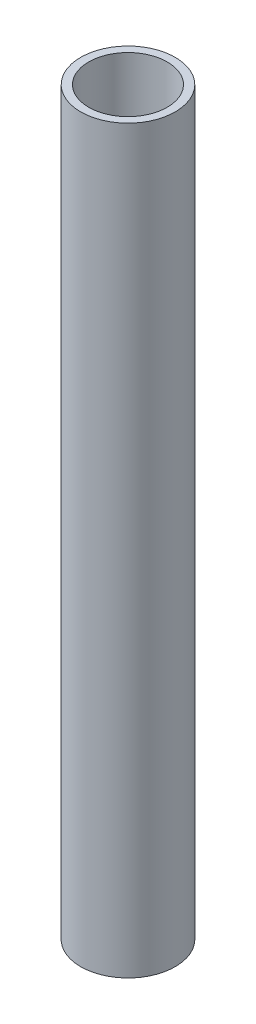
ISO-10303-21;
HEADER;
FILE_DESCRIPTION(('STEP AP214'),'2;1');
FILE_NAME('part.step','',(''),(''),'','','');
FILE_SCHEMA(('AUTOMOTIVE_DESIGN { 1 0 10303 214 1 1 1 1 }'));
ENDSEC;
DATA;
#1=APPLICATION_CONTEXT('core data for automotive mechanical design processes');
#2=APPLICATION_PROTOCOL_DEFINITION('international standard','automotive_design',2000,#1);
#3=PRODUCT_CONTEXT('',#1,'mechanical');
#4=PRODUCT('Part','Part','',(#3));
#5=PRODUCT_RELATED_PRODUCT_CATEGORY('part','',(#4));
#6=PRODUCT_DEFINITION_FORMATION('','',#4);
#7=PRODUCT_DEFINITION_CONTEXT('part definition',#1,'design');
#8=PRODUCT_DEFINITION('design','',#6,#7);
#9=PRODUCT_DEFINITION_SHAPE('','',#8);
#10=(LENGTH_UNIT() NAMED_UNIT(*) SI_UNIT(.MILLI.,.METRE.));
#11=(NAMED_UNIT(*) PLANE_ANGLE_UNIT() SI_UNIT($,.RADIAN.));
#12=(NAMED_UNIT(*) SI_UNIT($,.STERADIAN.) SOLID_ANGLE_UNIT());
#13=UNCERTAINTY_MEASURE_WITH_UNIT(LENGTH_MEASURE(1.E-05),#10,'distance_accuracy_value','');
#14=(GEOMETRIC_REPRESENTATION_CONTEXT(3) GLOBAL_UNCERTAINTY_ASSIGNED_CONTEXT((#13)) GLOBAL_UNIT_ASSIGNED_CONTEXT((#10,
#11,#12)) REPRESENTATION_CONTEXT('',''));
#15=CARTESIAN_POINT('',(0.,0.,0.));
#16=DIRECTION('',(0.,0.,1.));
#17=DIRECTION('',(1.,0.,0.));
#18=AXIS2_PLACEMENT_3D('',#15,#16,#17);
#19=CARTESIAN_POINT('',(0.,330.2,0.));
#20=DIRECTION('',(0.,1.,0.));
#21=DIRECTION('',(0.,0.,1.));
#22=AXIS2_PLACEMENT_3D('',#19,#20,#21);
#23=PLANE('',#22);
#24=CARTESIAN_POINT('',(0.,330.2,0.));
#25=DIRECTION('',(0.,1.,0.));
#26=DIRECTION('',(0.,0.,1.));
#27=AXIS2_PLACEMENT_3D('',#24,#25,#26);
#28=CIRCLE('',#27,21.082);
#29=CARTESIAN_POINT('',(0.,330.2,21.082));
#30=VERTEX_POINT('',#29);
#31=EDGE_CURVE('E10',#30,#30,#28,.T.);
#32=ORIENTED_EDGE('',*,*,#31,.T.);
#33=EDGE_LOOP('',(#32));
#34=FACE_BOUND('',#33,.T.);
#35=CARTESIAN_POINT('',(0.,330.2,0.));
#36=DIRECTION('',(0.,1.,0.));
#37=DIRECTION('',(0.,0.,1.));
#38=AXIS2_PLACEMENT_3D('',#35,#36,#37);
#39=CIRCLE('',#38,17.526);
#40=CARTESIAN_POINT('',(0.,330.2,17.526));
#41=VERTEX_POINT('',#40);
#42=EDGE_CURVE('E42',#41,#41,#39,.T.);
#43=ORIENTED_EDGE('',*,*,#42,.F.);
#44=EDGE_LOOP('',(#43));
#45=FACE_BOUND('',#44,.T.);
#46=ADVANCED_FACE('F31',(#34,#45),#23,.T.);
#47=CARTESIAN_POINT('',(0.,0.,0.));
#48=DIRECTION('',(0.,1.,0.));
#49=DIRECTION('',(0.,0.,1.));
#50=AXIS2_PLACEMENT_3D('',#47,#48,#49);
#51=PLANE('',#50);
#52=CARTESIAN_POINT('',(0.,0.,0.));
#53=DIRECTION('',(0.,1.,0.));
#54=DIRECTION('',(0.,0.,1.));
#55=AXIS2_PLACEMENT_3D('',#52,#53,#54);
#56=CIRCLE('',#55,21.082);
#57=CARTESIAN_POINT('',(0.,0.,21.082));
#58=VERTEX_POINT('',#57);
#59=EDGE_CURVE('E35',#58,#58,#56,.T.);
#60=ORIENTED_EDGE('',*,*,#59,.F.);
#61=EDGE_LOOP('',(#60));
#62=FACE_BOUND('',#61,.T.);
#63=CARTESIAN_POINT('',(0.,0.,0.));
#64=DIRECTION('',(0.,1.,0.));
#65=DIRECTION('',(0.,0.,1.));
#66=AXIS2_PLACEMENT_3D('',#63,#64,#65);
#67=CIRCLE('',#66,17.526);
#68=CARTESIAN_POINT('',(0.,0.,17.526));
#69=VERTEX_POINT('',#68);
#70=EDGE_CURVE('E44',#69,#69,#67,.T.);
#71=ORIENTED_EDGE('',*,*,#70,.T.);
#72=EDGE_LOOP('',(#71));
#73=FACE_BOUND('',#72,.T.);
#74=ADVANCED_FACE('F54',(#62,#73),#51,.F.);
#75=CARTESIAN_POINT('',(0.,330.2,0.));
#76=DIRECTION('',(0.,-1.,0.));
#77=DIRECTION('',(0.,0.,-1.));
#78=AXIS2_PLACEMENT_3D('',#75,#76,#77);
#79=CYLINDRICAL_SURFACE('',#78,21.082);
#80=ORIENTED_EDGE('',*,*,#31,.F.);
#81=EDGE_LOOP('',(#80));
#82=FACE_BOUND('',#81,.T.);
#83=ORIENTED_EDGE('',*,*,#59,.T.);
#84=EDGE_LOOP('',(#83));
#85=FACE_BOUND('',#84,.T.);
#86=ADVANCED_FACE('F33',(#82,#85),#79,.T.);
#87=CARTESIAN_POINT('',(0.,330.2,0.));
#88=DIRECTION('',(0.,-1.,0.));
#89=DIRECTION('',(0.,0.,-1.));
#90=AXIS2_PLACEMENT_3D('',#87,#88,#89);
#91=CYLINDRICAL_SURFACE('',#90,17.526);
#92=ORIENTED_EDGE('',*,*,#42,.T.);
#93=EDGE_LOOP('',(#92));
#94=FACE_BOUND('',#93,.T.);
#95=ORIENTED_EDGE('',*,*,#70,.F.);
#96=EDGE_LOOP('',(#95));
#97=FACE_BOUND('',#96,.T.);
#98=ADVANCED_FACE('F50',(#94,#97),#91,.F.);
#99=CLOSED_SHELL('',(#46,#74,#86,#98));
#100=MANIFOLD_SOLID_BREP('B2',#99);
#101=ADVANCED_BREP_SHAPE_REPRESENTATION('',(#18,#100),#14);
#102=SHAPE_DEFINITION_REPRESENTATION(#9,#101);
ENDSEC;
END-ISO-10303-21;
